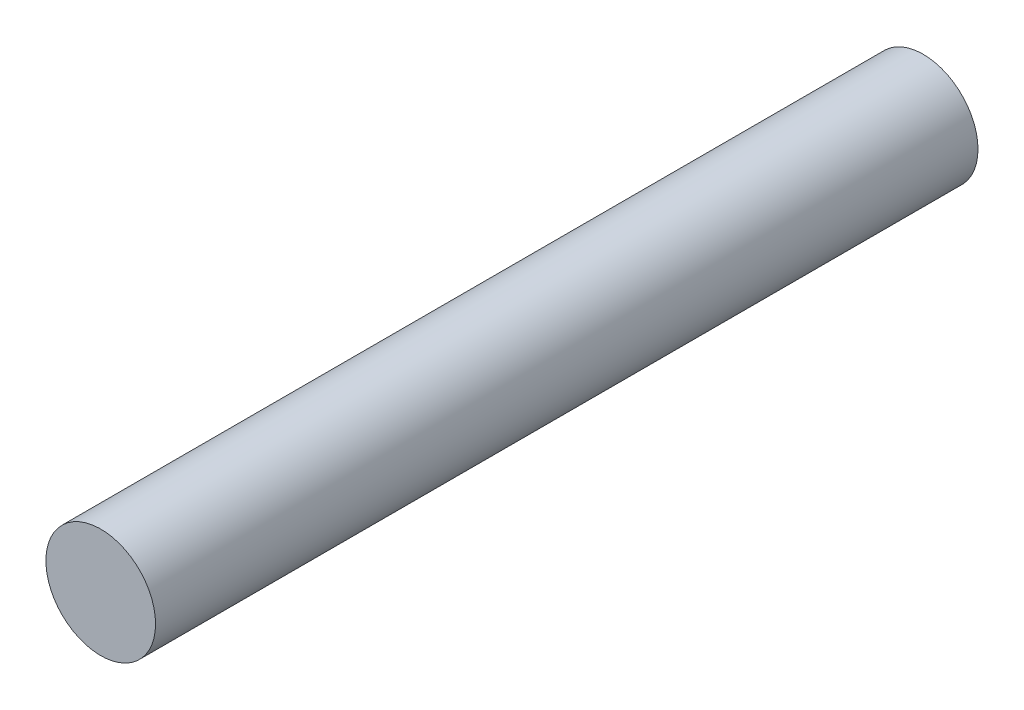
ISO-10303-21;
HEADER;
FILE_DESCRIPTION(('STEP AP214'),'2;1');
FILE_NAME('part.step','',(''),(''),'','','');
FILE_SCHEMA(('AUTOMOTIVE_DESIGN { 1 0 10303 214 1 1 1 1 }'));
ENDSEC;
DATA;
#1=APPLICATION_CONTEXT('core data for automotive mechanical design processes');
#2=APPLICATION_PROTOCOL_DEFINITION('international standard','automotive_design',2000,#1);
#3=PRODUCT_CONTEXT('',#1,'mechanical');
#4=PRODUCT('Part','Part','',(#3));
#5=PRODUCT_RELATED_PRODUCT_CATEGORY('part','',(#4));
#6=PRODUCT_DEFINITION_FORMATION('','',#4);
#7=PRODUCT_DEFINITION_CONTEXT('part definition',#1,'design');
#8=PRODUCT_DEFINITION('design','',#6,#7);
#9=PRODUCT_DEFINITION_SHAPE('','',#8);
#10=(LENGTH_UNIT() NAMED_UNIT(*) SI_UNIT(.MILLI.,.METRE.));
#11=(NAMED_UNIT(*) PLANE_ANGLE_UNIT() SI_UNIT($,.RADIAN.));
#12=(NAMED_UNIT(*) SI_UNIT($,.STERADIAN.) SOLID_ANGLE_UNIT());
#13=UNCERTAINTY_MEASURE_WITH_UNIT(LENGTH_MEASURE(1.E-05),#10,'distance_accuracy_value','');
#14=(GEOMETRIC_REPRESENTATION_CONTEXT(3) GLOBAL_UNCERTAINTY_ASSIGNED_CONTEXT((#13)) GLOBAL_UNIT_ASSIGNED_CONTEXT((#10,
#11,#12)) REPRESENTATION_CONTEXT('',''));
#15=CARTESIAN_POINT('',(0.,0.,0.));
#16=DIRECTION('',(0.,0.,1.));
#17=DIRECTION('',(1.,0.,0.));
#18=AXIS2_PLACEMENT_3D('',#15,#16,#17);
#19=CARTESIAN_POINT('',(0.,0.,75.));
#20=DIRECTION('',(0.,0.,-1.));
#21=DIRECTION('',(-1.,0.,0.));
#22=AXIS2_PLACEMENT_3D('',#19,#20,#21);
#23=CYLINDRICAL_SURFACE('',#22,5.);
#24=CARTESIAN_POINT('',(0.,0.,75.));
#25=DIRECTION('',(0.,0.,1.));
#26=DIRECTION('',(1.,0.,0.));
#27=AXIS2_PLACEMENT_3D('',#24,#25,#26);
#28=CIRCLE('',#27,5.);
#29=CARTESIAN_POINT('',(5.,0.,75.));
#30=VERTEX_POINT('',#29);
#31=EDGE_CURVE('E12',#30,#30,#28,.T.);
#32=ORIENTED_EDGE('',*,*,#31,.F.);
#33=EDGE_LOOP('',(#32));
#34=FACE_BOUND('',#33,.T.);
#35=CARTESIAN_POINT('',(0.,0.,0.));
#36=DIRECTION('',(0.,0.,1.));
#37=DIRECTION('',(1.,0.,0.));
#38=AXIS2_PLACEMENT_3D('',#35,#36,#37);
#39=CIRCLE('',#38,5.);
#40=CARTESIAN_POINT('',(5.,0.,0.));
#41=VERTEX_POINT('',#40);
#42=EDGE_CURVE('E43',#41,#41,#39,.T.);
#43=ORIENTED_EDGE('',*,*,#42,.T.);
#44=EDGE_LOOP('',(#43));
#45=FACE_BOUND('',#44,.T.);
#46=ADVANCED_FACE('F40',(#34,#45),#23,.T.);
#47=CARTESIAN_POINT('',(0.,0.,75.));
#48=DIRECTION('',(0.,0.,1.));
#49=DIRECTION('',(1.,0.,0.));
#50=AXIS2_PLACEMENT_3D('',#47,#48,#49);
#51=PLANE('',#50);
#52=ORIENTED_EDGE('',*,*,#31,.T.);
#53=EDGE_LOOP('',(#52));
#54=FACE_BOUND('',#53,.T.);
#55=ADVANCED_FACE('F55',(#54),#51,.T.);
#56=CARTESIAN_POINT('',(0.,0.,0.));
#57=DIRECTION('',(0.,0.,1.));
#58=DIRECTION('',(1.,0.,0.));
#59=AXIS2_PLACEMENT_3D('',#56,#57,#58);
#60=PLANE('',#59);
#61=ORIENTED_EDGE('',*,*,#42,.F.);
#62=EDGE_LOOP('',(#61));
#63=FACE_BOUND('',#62,.T.);
#64=ADVANCED_FACE('F53',(#63),#60,.F.);
#65=CLOSED_SHELL('',(#46,#55,#64));
#66=MANIFOLD_SOLID_BREP('B2',#65);
#67=ADVANCED_BREP_SHAPE_REPRESENTATION('',(#18,#66),#14);
#68=SHAPE_DEFINITION_REPRESENTATION(#9,#67);
ENDSEC;
END-ISO-10303-21;
